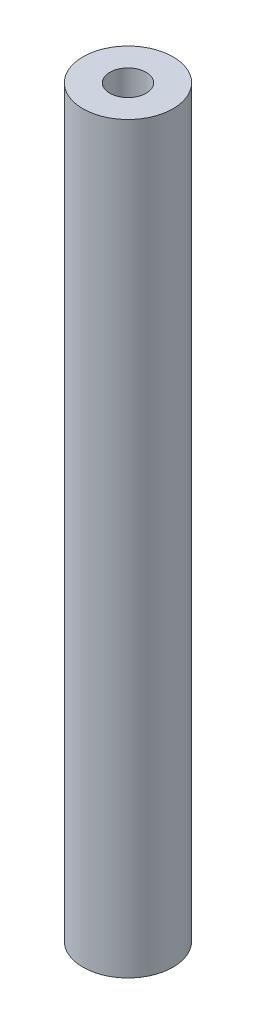
ISO-10303-21;
HEADER;
FILE_DESCRIPTION(('STEP AP214'),'2;1');
FILE_NAME('part.step','',(''),(''),'','','');
FILE_SCHEMA(('AUTOMOTIVE_DESIGN { 1 0 10303 214 1 1 1 1 }'));
ENDSEC;
DATA;
#1=APPLICATION_CONTEXT('core data for automotive mechanical design processes');
#2=APPLICATION_PROTOCOL_DEFINITION('international standard','automotive_design',2000,#1);
#3=PRODUCT_CONTEXT('',#1,'mechanical');
#4=PRODUCT('Part','Part','',(#3));
#5=PRODUCT_RELATED_PRODUCT_CATEGORY('part','',(#4));
#6=PRODUCT_DEFINITION_FORMATION('','',#4);
#7=PRODUCT_DEFINITION_CONTEXT('part definition',#1,'design');
#8=PRODUCT_DEFINITION('design','',#6,#7);
#9=PRODUCT_DEFINITION_SHAPE('','',#8);
#10=(LENGTH_UNIT() NAMED_UNIT(*) SI_UNIT(.MILLI.,.METRE.));
#11=(NAMED_UNIT(*) PLANE_ANGLE_UNIT() SI_UNIT($,.RADIAN.));
#12=(NAMED_UNIT(*) SI_UNIT($,.STERADIAN.) SOLID_ANGLE_UNIT());
#13=UNCERTAINTY_MEASURE_WITH_UNIT(LENGTH_MEASURE(1.E-05),#10,'distance_accuracy_value','');
#14=(GEOMETRIC_REPRESENTATION_CONTEXT(3) GLOBAL_UNCERTAINTY_ASSIGNED_CONTEXT((#13)) GLOBAL_UNIT_ASSIGNED_CONTEXT((#10,
#11,#12)) REPRESENTATION_CONTEXT('',''));
#15=CARTESIAN_POINT('',(0.,0.,0.));
#16=DIRECTION('',(0.,0.,1.));
#17=DIRECTION('',(1.,0.,0.));
#18=AXIS2_PLACEMENT_3D('',#15,#16,#17);
#19=CARTESIAN_POINT('',(0.,-82.55,0.));
#20=DIRECTION('',(0.,1.,0.));
#21=DIRECTION('',(0.,0.,1.));
#22=AXIS2_PLACEMENT_3D('',#19,#20,#21);
#23=CYLINDRICAL_SURFACE('',#22,5.);
#24=CARTESIAN_POINT('',(-1.50000000000002,-68.5,-4.76969600708472));
#25=CARTESIAN_POINT('',(-1.49999897633766,-68.4178054520576,-4.76969685726979));
#26=CARTESIAN_POINT('',(-1.49322108167144,-68.335600775856,-4.77184390209068));
#27=CARTESIAN_POINT('',(-1.46635844446751,-68.173594750408,-4.78016578302899));
#28=CARTESIAN_POINT('',(-1.4462692557358,-68.0937942134985,-4.78634196493467));
#29=CARTESIAN_POINT('',(-1.39352753269957,-67.9389652717282,-4.80196102485632));
#30=CARTESIAN_POINT('',(-1.36089589394245,-67.8639291703669,-4.81139846703232));
#31=CARTESIAN_POINT('',(-1.28406421917931,-67.7203780660047,-4.83246932547567));
#32=CARTESIAN_POINT('',(-1.23986245137054,-67.6518640413155,-4.84410307041019));
#33=CARTESIAN_POINT('',(-1.13964754141628,-67.5211336094226,-4.86866862185765));
#34=CARTESIAN_POINT('',(-1.08333207175808,-67.4591541020537,-4.88162808311635));
#35=CARTESIAN_POINT('',(-0.961136237579611,-67.3453620486775,-4.90714861936757));
#36=CARTESIAN_POINT('',(-0.895254645461126,-67.2935508095501,-4.91970964297705));
#37=CARTESIAN_POINT('',(-0.754111437793702,-67.2005373001667,-4.94333214579389));
#38=CARTESIAN_POINT('',(-0.678684021335823,-67.1595765755572,-4.95435724342404));
#39=CARTESIAN_POINT('',(-0.521624645369358,-67.0910127409572,-4.97334435920684));
#40=CARTESIAN_POINT('',(-0.439994028387916,-67.0634067501425,-4.98130703789495));
#41=CARTESIAN_POINT('',(-0.275323852630832,-67.0231199989095,-4.99307646003589));
#42=CARTESIAN_POINT('',(-0.192391398953802,-67.0100348723473,-4.99699557369338));
#43=CARTESIAN_POINT('',(-0.0254218237493149,-66.9978826753535,-5.00063201501348));
#44=CARTESIAN_POINT('',(0.0586150620503681,-66.998812660598,-5.00035022521079));
#45=CARTESIAN_POINT('',(0.222571156600161,-67.014392868543,-4.99569603817659));
#46=CARTESIAN_POINT('',(0.302536267641344,-67.0286051938098,-4.9914542020526));
#47=CARTESIAN_POINT('',(0.458889213442531,-67.0696313359942,-4.97951522112593));
#48=CARTESIAN_POINT('',(0.53527682132285,-67.0964459509426,-4.97181785750586));
#49=CARTESIAN_POINT('',(0.683347326351286,-67.1622120234185,-4.95365220986963));
#50=CARTESIAN_POINT('',(0.754965064694485,-67.2013012028072,-4.94315269676706));
#51=CARTESIAN_POINT('',(0.890764673783164,-67.2903978524282,-4.92049640648069));
#52=CARTESIAN_POINT('',(0.954944774872138,-67.3404079129635,-4.90833923637778));
#53=CARTESIAN_POINT('',(1.07666048152981,-67.4521977507516,-4.88311550488165));
#54=CARTESIAN_POINT('',(1.13384458040112,-67.5143569190297,-4.87003195321461));
#55=CARTESIAN_POINT('',(1.23707651539824,-67.64751001789,-4.84483979887497));
#56=CARTESIAN_POINT('',(1.28312324482853,-67.7185048253892,-4.83273129317019));
#57=CARTESIAN_POINT('',(1.36313995335452,-67.868239469249,-4.81077903197677));
#58=CARTESIAN_POINT('',(1.39698989237681,-67.9470470458629,-4.80095810695956));
#59=CARTESIAN_POINT('',(1.45083362878414,-68.1096072084455,-4.78496392548436));
#60=CARTESIAN_POINT('',(1.47083194640561,-68.1933581715345,-4.77878947915829));
#61=CARTESIAN_POINT('',(1.49574770282166,-68.3600823607393,-4.77104849541241));
#62=CARTESIAN_POINT('',(1.50119946380212,-68.442968223894,-4.7693187867044));
#63=CARTESIAN_POINT('',(1.49835947233063,-68.6084729000098,-4.77021192441924));
#64=CARTESIAN_POINT('',(1.4900696437133,-68.6910917487308,-4.77283416156589));
#65=CARTESIAN_POINT('',(1.4604576357419,-68.8514883779709,-4.78197558554912));
#66=CARTESIAN_POINT('',(1.4394796143128,-68.9293361642635,-4.78839176507489));
#67=CARTESIAN_POINT('',(1.3854857774794,-69.0804016908149,-4.80429141231227));
#68=CARTESIAN_POINT('',(1.3524681034276,-69.1536187141406,-4.81377535359073));
#69=CARTESIAN_POINT('',(1.274318711965,-69.2955174640721,-4.83505835023047));
#70=CARTESIAN_POINT('',(1.22888564172729,-69.3640247209858,-4.84691271069799));
#71=CARTESIAN_POINT('',(1.12755301600384,-69.4926381061808,-4.87148205646987));
#72=CARTESIAN_POINT('',(1.07165095534896,-69.5527422176128,-4.88419724730003));
#73=CARTESIAN_POINT('',(0.948455132493588,-69.6651804058147,-4.90963633548158));
#74=CARTESIAN_POINT('',(0.880811065857424,-69.717135628987,-4.92234245063004));
#75=CARTESIAN_POINT('',(0.737461784590238,-69.8089667010278,-4.94584851748651));
#76=CARTESIAN_POINT('',(0.661756970543932,-69.8488431497815,-4.95664856384717));
#77=CARTESIAN_POINT('',(0.504935504705207,-69.9150000305683,-4.97505970474957));
#78=CARTESIAN_POINT('',(0.423864622037823,-69.941382016159,-4.98269453424966));
#79=CARTESIAN_POINT('',(0.258169966504572,-69.9800609188904,-4.99401979596827));
#80=CARTESIAN_POINT('',(0.173547217354746,-69.9923618659484,-4.9977113567088));
#81=CARTESIAN_POINT('',(0.00665215388272635,-70.0022230440545,-5.00066544081399));
#82=CARTESIAN_POINT('',(-0.0755851790862232,-70.0003326954078,-5.00009305111322));
#83=CARTESIAN_POINT('',(-0.23851948116442,-69.9831783675009,-4.99497264465037));
#84=CARTESIAN_POINT('',(-0.319216537346544,-69.9679151465195,-4.99042485330462));
#85=CARTESIAN_POINT('',(-0.475935813041377,-69.9247883386004,-4.97791168358326));
#86=CARTESIAN_POINT('',(-0.551998927351414,-69.897061819351,-4.96998352900865));
#87=CARTESIAN_POINT('',(-0.698433237752075,-69.8299180854928,-4.9515294303945));
#88=CARTESIAN_POINT('',(-0.768803496050599,-69.7904989497138,-4.94100305949946));
#89=CARTESIAN_POINT('',(-0.904301892420584,-69.6996265425699,-4.91803965828228));
#90=CARTESIAN_POINT('',(-0.969190250076792,-69.6478285699992,-4.90555226923559));
#91=CARTESIAN_POINT('',(-1.08953757134597,-69.5342896116672,-4.88023537212333));
#92=CARTESIAN_POINT('',(-1.14499380960196,-69.4725457621018,-4.86740576641079));
#93=CARTESIAN_POINT('',(-1.2465626939455,-69.3386592216895,-4.84240680631319));
#94=CARTESIAN_POINT('',(-1.29234759757958,-69.2662614466095,-4.83026852693485));
#95=CARTESIAN_POINT('',(-1.37104313528777,-69.114444825839,-4.80852547508792));
#96=CARTESIAN_POINT('',(-1.40395995557291,-69.0350293763988,-4.79891948596955));
#97=CARTESIAN_POINT('',(-1.45301942532952,-68.8802595683937,-4.78427816717594));
#98=CARTESIAN_POINT('',(-1.47058859011234,-68.805391353069,-4.77886154840519));
#99=CARTESIAN_POINT('',(-1.49407818835146,-68.6536847775042,-4.77157042597166));
#100=CARTESIAN_POINT('',(-1.50000095706097,-68.5768468153547,-4.7696952122143));
#101=CARTESIAN_POINT('',(-1.50000000000002,-68.5,-4.76969600708472));
#102=B_SPLINE_CURVE_WITH_KNOTS('',3,(#24,#25,#26,#27,#28,#29,#30,#31,#32,#33,#34,#35,#36,#37,
#38,#39,#40,#41,#42,#43,#44,#45,#46,#47,#48,#49,#50,#51,#52,#53,#54,#55,#56,#57,#58,#59,#60,#61,
#62,#63,#64,#65,#66,#67,#68,#69,#70,#71,#72,#73,#74,#75,#76,#77,#78,#79,#80,#81,#82,#83,#84,#85,
#86,#87,#88,#89,#90,#91,#92,#93,#94,#95,#96,#97,#98,#99,#100,#101),.UNSPECIFIED.,.T.,.F.,(4,2,2,
2,2,2,2,2,2,2,2,2,2,2,2,2,2,2,2,2,2,2,2,2,2,2,2,2,2,2,2,2,2,2,2,2,2,2,4),(0.,0.246300165915535,
0.492682641689008,0.738656414466206,0.984667025370114,1.23773150007985,1.49082847871274,
1.74915939273647,2.00743455587879,2.2583214014956,2.50915554101443,2.75200125990883,
2.99486235890379,3.2405520933568,3.48630016590834,3.74152147023282,3.99676812491867,
4.25446238246274,4.51207250628416,4.76008080790314,5.00805439107393,5.24958594938823,
5.49115481045793,5.73920731809394,5.98731925928929,6.24479506100608,6.50225807324208,
6.75775391814331,7.01317662321689,7.25876303911227,7.50433553047761,7.74727096872226,
7.99024634491386,8.24099627054496,8.49181852629898,8.75011639669154,9.00828993963952,
9.23861153857455,9.46888695033568),.UNSPECIFIED.);
#103=CARTESIAN_POINT('',(1.50000000000001,-68.5,-4.76969600708473));
#104=VERTEX_POINT('',#103);
#105=CARTESIAN_POINT('',(-1.50000000000002,-68.5,-4.76969600708472));
#106=VERTEX_POINT('',#105);
#107=EDGE_CURVE('E217',#104,#106,#102,.T.);
#108=ORIENTED_EDGE('',*,*,#107,.F.);
#109=DIRECTION('',(0.,1.,0.));
#110=VECTOR('',#109,1.);
#111=CARTESIAN_POINT('',(1.5,-82.55,-4.76969600708473));
#112=LINE('',#111,#110);
#113=CARTESIAN_POINT('',(1.50000000000001,-63.5,-4.76969600708473));
#114=VERTEX_POINT('',#113);
#115=EDGE_CURVE('E11',#114,#104,#112,.F.);
#116=ORIENTED_EDGE('',*,*,#115,.F.);
#117=CARTESIAN_POINT('',(-1.50000000000002,-63.5,-4.76969600708472));
#118=CARTESIAN_POINT('',(-1.49999897633766,-63.4178054520576,-4.76969685726979));
#119=CARTESIAN_POINT('',(-1.49322108167144,-63.335600775856,-4.77184390209068));
#120=CARTESIAN_POINT('',(-1.46635844446751,-63.1735947504081,-4.78016578302899));
#121=CARTESIAN_POINT('',(-1.4462692557358,-63.0937942134985,-4.78634196493467));
#122=CARTESIAN_POINT('',(-1.39352753269957,-62.9389652717283,-4.80196102485632));
#123=CARTESIAN_POINT('',(-1.36089589394245,-62.8639291703669,-4.81139846703232));
#124=CARTESIAN_POINT('',(-1.28406421917931,-62.7203780660047,-4.83246932547567));
#125=CARTESIAN_POINT('',(-1.23986245137054,-62.6518640413155,-4.84410307041019));
#126=CARTESIAN_POINT('',(-1.13964754141628,-62.5211336094226,-4.86866862185765));
#127=CARTESIAN_POINT('',(-1.08333207175808,-62.4591541020537,-4.88162808311635));
#128=CARTESIAN_POINT('',(-0.961136237579609,-62.3453620486775,-4.90714861936757));
#129=CARTESIAN_POINT('',(-0.895254645461121,-62.2935508095501,-4.91970964297705));
#130=CARTESIAN_POINT('',(-0.754111437793697,-62.2005373001667,-4.94333214579389));
#131=CARTESIAN_POINT('',(-0.67868402133582,-62.1595765755572,-4.95435724342404));
#132=CARTESIAN_POINT('',(-0.521624645369357,-62.0910127409572,-4.97334435920684));
#133=CARTESIAN_POINT('',(-0.439994028387913,-62.0634067501425,-4.98130703789495));
#134=CARTESIAN_POINT('',(-0.27532385263083,-62.0231199989095,-4.99307646003589));
#135=CARTESIAN_POINT('',(-0.192391398953801,-62.0100348723473,-4.99699557369338));
#136=CARTESIAN_POINT('',(-0.0254218237493146,-61.9978826753536,-5.00063201501348));
#137=CARTESIAN_POINT('',(0.0586150620503687,-61.998812660598,-5.00035022521079));
#138=CARTESIAN_POINT('',(0.222571156600162,-62.014392868543,-4.99569603817658));
#139=CARTESIAN_POINT('',(0.302536267641344,-62.0286051938099,-4.9914542020526));
#140=CARTESIAN_POINT('',(0.45888921344253,-62.0696313359943,-4.97951522112593));
#141=CARTESIAN_POINT('',(0.535276821322849,-62.0964459509427,-4.97181785750586));
#142=CARTESIAN_POINT('',(0.683347326351285,-62.1622120234186,-4.95365220986963));
#143=CARTESIAN_POINT('',(0.754965064694483,-62.2013012028073,-4.94315269676706));
#144=CARTESIAN_POINT('',(0.890764673783162,-62.2903978524282,-4.92049640648069));
#145=CARTESIAN_POINT('',(0.954944774872136,-62.3404079129635,-4.90833923637778));
#146=CARTESIAN_POINT('',(1.0766604815298,-62.4521977507516,-4.88311550488165));
#147=CARTESIAN_POINT('',(1.13384458040112,-62.5143569190297,-4.87003195321461));
#148=CARTESIAN_POINT('',(1.23707651539824,-62.6475100178901,-4.84483979887497));
#149=CARTESIAN_POINT('',(1.28312324482853,-62.7185048253892,-4.83273129317019));
#150=CARTESIAN_POINT('',(1.36313995335451,-62.868239469249,-4.81077903197677));
#151=CARTESIAN_POINT('',(1.3969898923768,-62.9470470458629,-4.80095810695956));
#152=CARTESIAN_POINT('',(1.45083362878414,-63.1096072084456,-4.78496392548436));
#153=CARTESIAN_POINT('',(1.47083194640561,-63.1933581715346,-4.77878947915829));
#154=CARTESIAN_POINT('',(1.49574770282166,-63.3600823607393,-4.77104849541241));
#155=CARTESIAN_POINT('',(1.50119946380213,-63.442968223894,-4.7693187867044));
#156=CARTESIAN_POINT('',(1.49835947233063,-63.6084729000099,-4.77021192441924));
#157=CARTESIAN_POINT('',(1.4900696437133,-63.6910917487309,-4.77283416156589));
#158=CARTESIAN_POINT('',(1.4604576357419,-63.8514883779709,-4.78197558554912));
#159=CARTESIAN_POINT('',(1.4394796143128,-63.9293361642636,-4.78839176507489));
#160=CARTESIAN_POINT('',(1.3854857774794,-64.0804016908149,-4.80429141231227));
#161=CARTESIAN_POINT('',(1.3524681034276,-64.1536187141406,-4.81377535359073));
#162=CARTESIAN_POINT('',(1.274318711965,-64.2955174640721,-4.83505835023047));
#163=CARTESIAN_POINT('',(1.22888564172728,-64.3640247209858,-4.84691271069799));
#164=CARTESIAN_POINT('',(1.12755301600384,-64.4926381061808,-4.87148205646987));
#165=CARTESIAN_POINT('',(1.07165095534896,-64.5527422176128,-4.88419724730003));
#166=CARTESIAN_POINT('',(0.94845513249359,-64.6651804058148,-4.90963633548158));
#167=CARTESIAN_POINT('',(0.880811065857425,-64.717135628987,-4.92234245063004));
#168=CARTESIAN_POINT('',(0.737461784590238,-64.8089667010278,-4.94584851748651));
#169=CARTESIAN_POINT('',(0.661756970543932,-64.8488431497815,-4.95664856384717));
#170=CARTESIAN_POINT('',(0.504935504705207,-64.9150000305683,-4.97505970474957));
#171=CARTESIAN_POINT('',(0.423864622037824,-64.941382016159,-4.98269453424966));
#172=CARTESIAN_POINT('',(0.258169966504572,-64.9800609188904,-4.99401979596827));
#173=CARTESIAN_POINT('',(0.173547217354746,-64.9923618659484,-4.9977113567088));
#174=CARTESIAN_POINT('',(0.00665215388272632,-65.0022230440545,-5.00066544081399));
#175=CARTESIAN_POINT('',(-0.0755851790862232,-65.0003326954078,-5.00009305111322));
#176=CARTESIAN_POINT('',(-0.23851948116442,-64.9831783675009,-4.99497264465037));
#177=CARTESIAN_POINT('',(-0.319216537346545,-64.9679151465196,-4.99042485330462));
#178=CARTESIAN_POINT('',(-0.475935813041377,-64.9247883386004,-4.97791168358326));
#179=CARTESIAN_POINT('',(-0.551998927351414,-64.897061819351,-4.96998352900865));
#180=CARTESIAN_POINT('',(-0.698433237752075,-64.8299180854928,-4.9515294303945));
#181=CARTESIAN_POINT('',(-0.768803496050599,-64.7904989497138,-4.94100305949946));
#182=CARTESIAN_POINT('',(-0.904301892420584,-64.69962654257,-4.91803965828228));
#183=CARTESIAN_POINT('',(-0.969190250076792,-64.6478285699992,-4.90555226923559));
#184=CARTESIAN_POINT('',(-1.08953757134597,-64.5342896116672,-4.88023537212333));
#185=CARTESIAN_POINT('',(-1.14499380960196,-64.4725457621018,-4.86740576641079));
#186=CARTESIAN_POINT('',(-1.2465626939455,-64.3386592216895,-4.84240680631319));
#187=CARTESIAN_POINT('',(-1.29234759757958,-64.2662614466096,-4.83026852693485));
#188=CARTESIAN_POINT('',(-1.37104313528777,-64.114444825839,-4.80852547508792));
#189=CARTESIAN_POINT('',(-1.40395995557291,-64.0350293763988,-4.79891948596955));
#190=CARTESIAN_POINT('',(-1.45301942532952,-63.8802595683937,-4.78427816717594));
#191=CARTESIAN_POINT('',(-1.47058859011234,-63.805391353069,-4.77886154840519));
#192=CARTESIAN_POINT('',(-1.49407818835146,-63.6536847775042,-4.77157042597166));
#193=CARTESIAN_POINT('',(-1.50000095706097,-63.5768468153547,-4.7696952122143));
#194=CARTESIAN_POINT('',(-1.50000000000002,-63.5,-4.76969600708472));
#195=B_SPLINE_CURVE_WITH_KNOTS('',3,(#117,#118,#119,#120,#121,#122,#123,#124,#125,#126,#127,
#128,#129,#130,#131,#132,#133,#134,#135,#136,#137,#138,#139,#140,#141,#142,#143,#144,#145,#146,
#147,#148,#149,#150,#151,#152,#153,#154,#155,#156,#157,#158,#159,#160,#161,#162,#163,#164,#165,
#166,#167,#168,#169,#170,#171,#172,#173,#174,#175,#176,#177,#178,#179,#180,#181,#182,#183,#184,
#185,#186,#187,#188,#189,#190,#191,#192,#193,#194),.UNSPECIFIED.,.T.,.F.,(4,2,2,2,2,2,2,2,2,2,2,
2,2,2,2,2,2,2,2,2,2,2,2,2,2,2,2,2,2,2,2,2,2,2,2,2,2,2,4),(0.,0.246300165915535,
0.492682641689008,0.738656414466206,0.984667025370114,1.23773150007985,1.49082847871275,
1.74915939273647,2.0074345558788,2.25832140149561,2.50915554101443,2.75200125990883,
2.99486235890379,3.24055209335679,3.48630016590834,3.74152147023282,3.99676812491867,
4.25446238246271,4.51207250628416,4.76008080790315,5.00805439107393,5.24958594938823,
5.49115481045793,5.73920731809395,5.98731925928929,6.24479506100608,6.50225807324209,
6.75775391814331,7.01317662321689,7.25876303911227,7.50433553047761,7.74727096872226,
7.99024634491386,8.24099627054496,8.49181852629898,8.75011639669154,9.00828993963953,
9.23861153857455,9.46888695033568),.UNSPECIFIED.);
#196=CARTESIAN_POINT('',(-1.50000000000002,-63.5,-4.76969600708472));
#197=VERTEX_POINT('',#196);
#198=EDGE_CURVE('E49',#197,#114,#195,.T.);
#199=ORIENTED_EDGE('',*,*,#198,.F.);
#200=DIRECTION('',(0.,1.,0.));
#201=VECTOR('',#200,1.);
#202=CARTESIAN_POINT('',(-1.50000000000002,-82.55,-4.76969600708472));
#203=LINE('',#202,#201);
#204=EDGE_CURVE('E263',#197,#106,#203,.F.);
#205=ORIENTED_EDGE('',*,*,#204,.T.);
#206=EDGE_LOOP('',(#108,#116,#199,#205));
#207=FACE_BOUND('',#206,.T.);
#208=CARTESIAN_POINT('',(-1.5,-15.39,-4.76969600708473));
#209=CARTESIAN_POINT('',(-1.49999897633764,-15.3078054520576,-4.7696968572698));
#210=CARTESIAN_POINT('',(-1.49322108167142,-15.225600775856,-4.77184390209069));
#211=CARTESIAN_POINT('',(-1.46635844446749,-15.063594750408,-4.780165783029));
#212=CARTESIAN_POINT('',(-1.44626925573578,-14.9837942134985,-4.78634196493468));
#213=CARTESIAN_POINT('',(-1.39352753269955,-14.8289652717283,-4.80196102485632));
#214=CARTESIAN_POINT('',(-1.36089589394243,-14.7539291703669,-4.81139846703232));
#215=CARTESIAN_POINT('',(-1.28406421917929,-14.6103780660047,-4.83246932547567));
#216=CARTESIAN_POINT('',(-1.23986245137053,-14.5418640413156,-4.84410307041019));
#217=CARTESIAN_POINT('',(-1.13964754141627,-14.4111336094226,-4.86866862185765));
#218=CARTESIAN_POINT('',(-1.08333207175807,-14.3491541020537,-4.88162808311636));
#219=CARTESIAN_POINT('',(-0.9611362375796,-14.2353620486775,-4.90714861936757));
#220=CARTESIAN_POINT('',(-0.895254645461113,-14.1835508095501,-4.91970964297705));
#221=CARTESIAN_POINT('',(-0.754111437793691,-14.0905373001667,-4.94333214579389));
#222=CARTESIAN_POINT('',(-0.678684021335816,-14.0495765755572,-4.95435724342404));
#223=CARTESIAN_POINT('',(-0.521624645369355,-13.9810127409572,-4.97334435920684));
#224=CARTESIAN_POINT('',(-0.439994028387913,-13.9534067501425,-4.98130703789495));
#225=CARTESIAN_POINT('',(-0.27532385263083,-13.9131199989095,-4.99307646003589));
#226=CARTESIAN_POINT('',(-0.192391398953802,-13.9000348723473,-4.99699557369338));
#227=CARTESIAN_POINT('',(-0.0254218237493163,-13.8878826753536,-5.00063201501348));
#228=CARTESIAN_POINT('',(0.0586150620503669,-13.888812660598,-5.00035022521079));
#229=CARTESIAN_POINT('',(0.222571156600159,-13.904392868543,-4.99569603817659));
#230=CARTESIAN_POINT('',(0.30253626764134,-13.9186051938099,-4.9914542020526));
#231=CARTESIAN_POINT('',(0.458889213442525,-13.9596313359943,-4.97951522112593));
#232=CARTESIAN_POINT('',(0.535276821322844,-13.9864459509427,-4.97181785750586));
#233=CARTESIAN_POINT('',(0.683347326351279,-14.0522120234185,-4.95365220986963));
#234=CARTESIAN_POINT('',(0.754965064694476,-14.0913012028073,-4.94315269676706));
#235=CARTESIAN_POINT('',(0.890764673783154,-14.1803978524282,-4.92049640648069));
#236=CARTESIAN_POINT('',(0.954944774872129,-14.2304079129635,-4.90833923637778));
#237=CARTESIAN_POINT('',(1.0766604815298,-14.3421977507516,-4.88311550488165));
#238=CARTESIAN_POINT('',(1.13384458040111,-14.4043569190297,-4.87003195321461));
#239=CARTESIAN_POINT('',(1.23707651539823,-14.53751001789,-4.84483979887497));
#240=CARTESIAN_POINT('',(1.28312324482852,-14.6085048253892,-4.8327312931702));
#241=CARTESIAN_POINT('',(1.3631399533545,-14.758239469249,-4.81077903197678));
#242=CARTESIAN_POINT('',(1.39698989237679,-14.8370470458629,-4.80095810695957));
#243=CARTESIAN_POINT('',(1.45083362878413,-14.9996072084455,-4.78496392548436));
#244=CARTESIAN_POINT('',(1.4708319464056,-15.0833581715345,-4.7787894791583));
#245=CARTESIAN_POINT('',(1.49574770282165,-15.2500823607393,-4.77104849541241));
#246=CARTESIAN_POINT('',(1.50119946380212,-15.332968223894,-4.76931878670441));
#247=CARTESIAN_POINT('',(1.49835947233062,-15.4984729000099,-4.77021192441924));
#248=CARTESIAN_POINT('',(1.4900696437133,-15.5810917487308,-4.77283416156589));
#249=CARTESIAN_POINT('',(1.4604576357419,-15.7414883779709,-4.78197558554912));
#250=CARTESIAN_POINT('',(1.4394796143128,-15.8193361642635,-4.78839176507489));
#251=CARTESIAN_POINT('',(1.3854857774794,-15.9704016908149,-4.80429141231227));
#252=CARTESIAN_POINT('',(1.3524681034276,-16.0436187141406,-4.81377535359073));
#253=CARTESIAN_POINT('',(1.274318711965,-16.1855174640721,-4.83505835023047));
#254=CARTESIAN_POINT('',(1.22888564172729,-16.2540247209858,-4.84691271069799));
#255=CARTESIAN_POINT('',(1.12755301600385,-16.3826381061808,-4.87148205646987));
#256=CARTESIAN_POINT('',(1.07165095534897,-16.4427422176128,-4.88419724730003));
#257=CARTESIAN_POINT('',(0.948455132493601,-16.5551804058147,-4.90963633548158));
#258=CARTESIAN_POINT('',(0.880811065857437,-16.607135628987,-4.92234245063004));
#259=CARTESIAN_POINT('',(0.737461784590251,-16.6989667010277,-4.94584851748651));
#260=CARTESIAN_POINT('',(0.661756970543946,-16.7388431497815,-4.95664856384717));
#261=CARTESIAN_POINT('',(0.504935504705224,-16.8050000305683,-4.97505970474957));
#262=CARTESIAN_POINT('',(0.423864622037842,-16.831382016159,-4.98269453424965));
#263=CARTESIAN_POINT('',(0.258169966504592,-16.8700609188904,-4.99401979596827));
#264=CARTESIAN_POINT('',(0.173547217354766,-16.8823618659484,-4.9977113567088));
#265=CARTESIAN_POINT('',(0.00665215388274591,-16.8922230440545,-5.00066544081399));
#266=CARTESIAN_POINT('',(-0.0755851790862039,-16.8903326954078,-5.00009305111322));
#267=CARTESIAN_POINT('',(-0.238519481164402,-16.8731783675009,-4.99497264465037));
#268=CARTESIAN_POINT('',(-0.319216537346527,-16.8579151465196,-4.99042485330463));
#269=CARTESIAN_POINT('',(-0.475935813041356,-16.8147883386004,-4.97791168358327));
#270=CARTESIAN_POINT('',(-0.55199892735139,-16.787061819351,-4.96998352900866));
#271=CARTESIAN_POINT('',(-0.698433237752051,-16.7199180854928,-4.9515294303945));
#272=CARTESIAN_POINT('',(-0.768803496050578,-16.6804989497138,-4.94100305949946));
#273=CARTESIAN_POINT('',(-0.904301892420561,-16.58962654257,-4.91803965828228));
#274=CARTESIAN_POINT('',(-0.969190250076765,-16.5378285699992,-4.90555226923559));
#275=CARTESIAN_POINT('',(-1.08953757134594,-16.4242896116672,-4.88023537212334));
#276=CARTESIAN_POINT('',(-1.14499380960193,-16.3625457621018,-4.86740576641079));
#277=CARTESIAN_POINT('',(-1.24656269394548,-16.2286592216895,-4.84240680631319));
#278=CARTESIAN_POINT('',(-1.29234759757956,-16.1562614466096,-4.83026852693485));
#279=CARTESIAN_POINT('',(-1.37104313528776,-16.004444825839,-4.80852547508793));
#280=CARTESIAN_POINT('',(-1.40395995557288,-15.9250293763988,-4.79891948596956));
#281=CARTESIAN_POINT('',(-1.45301942532949,-15.7702595683937,-4.78427816717594));
#282=CARTESIAN_POINT('',(-1.47058859011231,-15.695391353069,-4.7788615484052));
#283=CARTESIAN_POINT('',(-1.49407818835144,-15.5436847775042,-4.77157042597167));
#284=CARTESIAN_POINT('',(-1.50000095706095,-15.4668468153547,-4.7696952122143));
#285=CARTESIAN_POINT('',(-1.5,-15.39,-4.76969600708473));
#286=B_SPLINE_CURVE_WITH_KNOTS('',3,(#208,#209,#210,#211,#212,#213,#214,#215,#216,#217,#218,
#219,#220,#221,#222,#223,#224,#225,#226,#227,#228,#229,#230,#231,#232,#233,#234,#235,#236,#237,
#238,#239,#240,#241,#242,#243,#244,#245,#246,#247,#248,#249,#250,#251,#252,#253,#254,#255,#256,
#257,#258,#259,#260,#261,#262,#263,#264,#265,#266,#267,#268,#269,#270,#271,#272,#273,#274,#275,
#276,#277,#278,#279,#280,#281,#282,#283,#284,#285),.UNSPECIFIED.,.T.,.F.,(4,2,2,2,2,2,2,2,2,2,2,
2,2,2,2,2,2,2,2,2,2,2,2,2,2,2,2,2,2,2,2,2,2,2,2,2,2,2,4),(0.,0.246300165915544,
0.492682641688999,0.738656414466193,0.9846670253701,1.23773150007984,1.49082847871273,
1.74915939273644,2.00743455587877,2.25832140149558,2.5091555410144,2.7520012599088,
2.99486235890376,3.24055209335676,3.4863001659083,3.74152147023278,3.99676812491863,
4.25446238246266,4.51207250628411,4.76008080790309,5.00805439107387,5.24958594938817,
5.49115481045787,5.73920731809388,5.98731925928922,6.24479506100602,6.50225807324202,
6.75775391814324,7.01317662321682,7.2587630391122,7.50433553047754,7.74727096872219,
7.99024634491378,8.24099627054488,8.4918185262989,8.75011639669147,9.00828993963944,
9.23861153857447,9.4688869503356),.UNSPECIFIED.);
#287=CARTESIAN_POINT('',(1.5,-15.39,-4.76969600708473));
#288=VERTEX_POINT('',#287);
#289=CARTESIAN_POINT('',(-1.5,-15.39,-4.76969600708473));
#290=VERTEX_POINT('',#289);
#291=EDGE_CURVE('E178',#288,#290,#286,.T.);
#292=ORIENTED_EDGE('',*,*,#291,.F.);
#293=DIRECTION('',(0.,1.,0.));
#294=VECTOR('',#293,1.);
#295=CARTESIAN_POINT('',(1.49999999999999,-82.55,-4.76969600708473));
#296=LINE('',#295,#294);
#297=CARTESIAN_POINT('',(1.5,-10.39,-4.76969600708473));
#298=VERTEX_POINT('',#297);
#299=EDGE_CURVE('E226',#298,#288,#296,.F.);
#300=ORIENTED_EDGE('',*,*,#299,.F.);
#301=CARTESIAN_POINT('',(-1.49999999999999,-10.39,-4.76969600708473));
#302=CARTESIAN_POINT('',(-1.49999897633763,-10.3078054520576,-4.7696968572698));
#303=CARTESIAN_POINT('',(-1.49322108167141,-10.225600775856,-4.77184390209069));
#304=CARTESIAN_POINT('',(-1.46635844446748,-10.0635947504081,-4.780165783029));
#305=CARTESIAN_POINT('',(-1.44626925573577,-9.98379421349855,-4.78634196493468));
#306=CARTESIAN_POINT('',(-1.39352753269954,-9.82896527172828,-4.80196102485633));
#307=CARTESIAN_POINT('',(-1.36089589394242,-9.75392917036693,-4.81139846703232));
#308=CARTESIAN_POINT('',(-1.28406421917928,-9.61037806600471,-4.83246932547567));
#309=CARTESIAN_POINT('',(-1.23986245137051,-9.54186404131558,-4.8441030704102));
#310=CARTESIAN_POINT('',(-1.13964754141626,-9.41113360942264,-4.86866862185766));
#311=CARTESIAN_POINT('',(-1.08333207175806,-9.34915410205372,-4.88162808311636));
#312=CARTESIAN_POINT('',(-0.961136237579587,-9.2353620486775,-4.90714861936757));
#313=CARTESIAN_POINT('',(-0.8952546454611,-9.18355080955013,-4.91970964297705));
#314=CARTESIAN_POINT('',(-0.754111437793678,-9.09053730016671,-4.94333214579389));
#315=CARTESIAN_POINT('',(-0.678684021335803,-9.0495765755572,-4.95435724342404));
#316=CARTESIAN_POINT('',(-0.521624645369342,-8.98101274095726,-4.97334435920684));
#317=CARTESIAN_POINT('',(-0.4399940283879,-8.95340675014256,-4.98130703789495));
#318=CARTESIAN_POINT('',(-0.275323852630817,-8.9131199989095,-4.99307646003589));
#319=CARTESIAN_POINT('',(-0.192391398953789,-8.90003487234731,-4.99699557369338));
#320=CARTESIAN_POINT('',(-0.0254218237493032,-8.88788267535357,-5.00063201501348));
#321=CARTESIAN_POINT('',(0.0586150620503801,-8.88881266059805,-5.00035022521079));
#322=CARTESIAN_POINT('',(0.222571156600172,-8.90439286854304,-4.99569603817658));
#323=CARTESIAN_POINT('',(0.302536267641353,-8.91860519380988,-4.9914542020526));
#324=CARTESIAN_POINT('',(0.458889213442538,-8.9596313359943,-4.97951522112593));
#325=CARTESIAN_POINT('',(0.535276821322857,-8.98644595094268,-4.97181785750586));
#326=CARTESIAN_POINT('',(0.683347326351292,-9.05221202341857,-4.95365220986963));
#327=CARTESIAN_POINT('',(0.754965064694489,-9.09130120280728,-4.94315269676706));
#328=CARTESIAN_POINT('',(0.890764673783167,-9.18039785242824,-4.92049640648069));
#329=CARTESIAN_POINT('',(0.954944774872142,-9.2304079129635,-4.90833923637778));
#330=CARTESIAN_POINT('',(1.07666048152981,-9.34219775075161,-4.88311550488165));
#331=CARTESIAN_POINT('',(1.13384458040113,-9.40435691902975,-4.87003195321461));
#332=CARTESIAN_POINT('',(1.23707651539825,-9.53751001789006,-4.84483979887497));
#333=CARTESIAN_POINT('',(1.28312324482854,-9.60850482538924,-4.83273129317019));
#334=CARTESIAN_POINT('',(1.36313995335451,-9.758239469249,-4.81077903197677));
#335=CARTESIAN_POINT('',(1.39698989237681,-9.83704704586293,-4.80095810695956));
#336=CARTESIAN_POINT('',(1.45083362878415,-9.99960720844556,-4.78496392548436));
#337=CARTESIAN_POINT('',(1.47083194640561,-10.0833581715346,-4.77878947915829));
#338=CARTESIAN_POINT('',(1.49574770282166,-10.2500823607393,-4.77104849541241));
#339=CARTESIAN_POINT('',(1.50119946380213,-10.332968223894,-4.7693187867044));
#340=CARTESIAN_POINT('',(1.49835947233063,-10.4984729000099,-4.77021192441923));
#341=CARTESIAN_POINT('',(1.49006964371331,-10.5810917487309,-4.77283416156589));
#342=CARTESIAN_POINT('',(1.46045763574191,-10.7414883779709,-4.78197558554912));
#343=CARTESIAN_POINT('',(1.43947961431281,-10.8193361642635,-4.78839176507488));
#344=CARTESIAN_POINT('',(1.38548577747941,-10.9704016908149,-4.80429141231227));
#345=CARTESIAN_POINT('',(1.35246810342761,-11.0436187141406,-4.81377535359073));
#346=CARTESIAN_POINT('',(1.27431871196502,-11.1855174640721,-4.83505835023047));
#347=CARTESIAN_POINT('',(1.2288856417273,-11.2540247209858,-4.84691271069798));
#348=CARTESIAN_POINT('',(1.12755301600386,-11.3826381061808,-4.87148205646987));
#349=CARTESIAN_POINT('',(1.07165095534898,-11.4427422176128,-4.88419724730003));
#350=CARTESIAN_POINT('',(0.948455132493612,-11.5551804058147,-4.90963633548158));
#351=CARTESIAN_POINT('',(0.880811065857447,-11.607135628987,-4.92234245063004));
#352=CARTESIAN_POINT('',(0.737461784590263,-11.6989667010278,-4.9458485174865));
#353=CARTESIAN_POINT('',(0.661756970543958,-11.7388431497815,-4.95664856384717));
#354=CARTESIAN_POINT('',(0.504935504705236,-11.8050000305683,-4.97505970474957));
#355=CARTESIAN_POINT('',(0.423864622037853,-11.831382016159,-4.98269453424965));
#356=CARTESIAN_POINT('',(0.258169966504602,-11.8700609188904,-4.99401979596827));
#357=CARTESIAN_POINT('',(0.173547217354777,-11.8823618659484,-4.9977113567088));
#358=CARTESIAN_POINT('',(0.00665215388275694,-11.8922230440545,-5.00066544081399));
#359=CARTESIAN_POINT('',(-0.0755851790861925,-11.8903326954078,-5.00009305111322));
#360=CARTESIAN_POINT('',(-0.23851948116439,-11.8731783675009,-4.99497264465037));
#361=CARTESIAN_POINT('',(-0.319216537346515,-11.8579151465196,-4.99042485330463));
#362=CARTESIAN_POINT('',(-0.475935813041345,-11.8147883386004,-4.97791168358327));
#363=CARTESIAN_POINT('',(-0.551998927351378,-11.787061819351,-4.96998352900866));
#364=CARTESIAN_POINT('',(-0.698433237752039,-11.7199180854928,-4.9515294303945));
#365=CARTESIAN_POINT('',(-0.768803496050566,-11.6804989497138,-4.94100305949946));
#366=CARTESIAN_POINT('',(-0.904301892420549,-11.58962654257,-4.91803965828228));
#367=CARTESIAN_POINT('',(-0.969190250076752,-11.5378285699992,-4.90555226923559));
#368=CARTESIAN_POINT('',(-1.08953757134593,-11.4242896116672,-4.88023537212334));
#369=CARTESIAN_POINT('',(-1.14499380960192,-11.3625457621019,-4.86740576641079));
#370=CARTESIAN_POINT('',(-1.24656269394547,-11.2286592216895,-4.84240680631319));
#371=CARTESIAN_POINT('',(-1.29234759757955,-11.1562614466096,-4.83026852693486));
#372=CARTESIAN_POINT('',(-1.37104313528774,-11.004444825839,-4.80852547508793));
#373=CARTESIAN_POINT('',(-1.40395995557287,-10.9250293763988,-4.79891948596956));
#374=CARTESIAN_POINT('',(-1.45301942532948,-10.7702595683937,-4.78427816717595));
#375=CARTESIAN_POINT('',(-1.4705885901123,-10.695391353069,-4.7788615484052));
#376=CARTESIAN_POINT('',(-1.49407818835143,-10.5436847775042,-4.77157042597167));
#377=CARTESIAN_POINT('',(-1.50000095706094,-10.4668468153548,-4.76969521221431));
#378=CARTESIAN_POINT('',(-1.49999999999999,-10.39,-4.76969600708473));
#379=B_SPLINE_CURVE_WITH_KNOTS('',3,(#301,#302,#303,#304,#305,#306,#307,#308,#309,#310,#311,
#312,#313,#314,#315,#316,#317,#318,#319,#320,#321,#322,#323,#324,#325,#326,#327,#328,#329,#330,
#331,#332,#333,#334,#335,#336,#337,#338,#339,#340,#341,#342,#343,#344,#345,#346,#347,#348,#349,
#350,#351,#352,#353,#354,#355,#356,#357,#358,#359,#360,#361,#362,#363,#364,#365,#366,#367,#368,
#369,#370,#371,#372,#373,#374,#375,#376,#377,#378),.UNSPECIFIED.,.T.,.F.,(4,2,2,2,2,2,2,2,2,2,2,
2,2,2,2,2,2,2,2,2,2,2,2,2,2,2,2,2,2,2,2,2,2,2,2,2,2,2,4),(0.,0.246300165915542,
0.492682641688999,0.738656414466193,0.9846670253701,1.23773150007984,1.49082847871273,
1.74915939273644,2.00743455587877,2.25832140149558,2.5091555410144,2.7520012599088,
2.99486235890376,3.24055209335676,3.4863001659083,3.74152147023278,3.99676812491863,
4.25446238246266,4.51207250628411,4.76008080790309,5.00805439107388,5.24958594938817,
5.49115481045787,5.73920731809388,5.98731925928923,6.24479506100602,6.50225807324202,
6.75775391814325,7.01317662321682,7.2587630391122,7.50433553047754,7.74727096872219,
7.99024634491378,8.24099627054488,8.4918185262989,8.75011639669147,9.00828993963944,
9.23861153857447,9.4688869503356),.UNSPECIFIED.);
#380=CARTESIAN_POINT('',(-1.5,-10.39,-4.76969600708473));
#381=VERTEX_POINT('',#380);
#382=EDGE_CURVE('E231',#381,#298,#379,.T.);
#383=ORIENTED_EDGE('',*,*,#382,.F.);
#384=DIRECTION('',(0.,1.,0.));
#385=VECTOR('',#384,1.);
#386=CARTESIAN_POINT('',(-1.50000000000001,-82.55,-4.76969600708473));
#387=LINE('',#386,#385);
#388=EDGE_CURVE('E186',#381,#290,#387,.F.);
#389=ORIENTED_EDGE('',*,*,#388,.T.);
#390=EDGE_LOOP('',(#292,#300,#383,#389));
#391=FACE_BOUND('',#390,.T.);
#392=CARTESIAN_POINT('',(0.,-82.55,0.));
#393=DIRECTION('',(0.,1.,0.));
#394=DIRECTION('',(0.,0.,1.));
#395=AXIS2_PLACEMENT_3D('',#392,#393,#394);
#396=CIRCLE('',#395,5.);
#397=CARTESIAN_POINT('',(0.,-82.55,5.));
#398=VERTEX_POINT('',#397);
#399=EDGE_CURVE('E175',#398,#398,#396,.T.);
#400=ORIENTED_EDGE('',*,*,#399,.T.);
#401=EDGE_LOOP('',(#400));
#402=FACE_BOUND('',#401,.T.);
#403=CARTESIAN_POINT('',(0.,0.,0.));
#404=DIRECTION('',(0.,1.,0.));
#405=DIRECTION('',(0.,0.,1.));
#406=AXIS2_PLACEMENT_3D('',#403,#404,#405);
#407=CIRCLE('',#406,5.);
#408=CARTESIAN_POINT('',(0.,0.,5.));
#409=VERTEX_POINT('',#408);
#410=EDGE_CURVE('E146',#409,#409,#407,.T.);
#411=ORIENTED_EDGE('',*,*,#410,.F.);
#412=EDGE_LOOP('',(#411));
#413=FACE_BOUND('',#412,.T.);
#414=ADVANCED_FACE('F41',(#207,#391,#402,#413),#23,.T.);
#415=CARTESIAN_POINT('',(0.,-82.55,0.));
#416=DIRECTION('',(0.,1.,0.));
#417=DIRECTION('',(0.,0.,1.));
#418=AXIS2_PLACEMENT_3D('',#415,#416,#417);
#419=PLANE('',#418);
#420=CARTESIAN_POINT('',(0.,-82.55,0.));
#421=DIRECTION('',(0.,-1.,0.));
#422=DIRECTION('',(0.,0.,-1.));
#423=AXIS2_PLACEMENT_3D('',#420,#421,#422);
#424=CIRCLE('',#423,2.0193);
#425=CARTESIAN_POINT('',(0.,-82.55,-2.0193));
#426=VERTEX_POINT('',#425);
#427=EDGE_CURVE('E120',#426,#426,#424,.T.);
#428=ORIENTED_EDGE('',*,*,#427,.F.);
#429=EDGE_LOOP('',(#428));
#430=FACE_BOUND('',#429,.T.);
#431=ORIENTED_EDGE('',*,*,#399,.F.);
#432=EDGE_LOOP('',(#431));
#433=FACE_BOUND('',#432,.T.);
#434=ADVANCED_FACE('F203',(#430,#433),#419,.F.);
#435=CARTESIAN_POINT('',(0.,0.,0.));
#436=DIRECTION('',(0.,1.,0.));
#437=DIRECTION('',(0.,0.,1.));
#438=AXIS2_PLACEMENT_3D('',#435,#436,#437);
#439=PLANE('',#438);
#440=CARTESIAN_POINT('',(0.,0.,0.));
#441=DIRECTION('',(0.,1.,0.));
#442=DIRECTION('',(0.,0.,1.));
#443=AXIS2_PLACEMENT_3D('',#440,#441,#442);
#444=CIRCLE('',#443,2.0193);
#445=CARTESIAN_POINT('',(0.,0.,2.0193));
#446=VERTEX_POINT('',#445);
#447=EDGE_CURVE('E119',#446,#446,#444,.T.);
#448=ORIENTED_EDGE('',*,*,#447,.F.);
#449=EDGE_LOOP('',(#448));
#450=FACE_BOUND('',#449,.T.);
#451=ORIENTED_EDGE('',*,*,#410,.T.);
#452=EDGE_LOOP('',(#451));
#453=FACE_BOUND('',#452,.T.);
#454=ADVANCED_FACE('F201',(#450,#453),#439,.T.);
#455=CARTESIAN_POINT('',(1.5,0.,-2.46));
#456=DIRECTION('',(1.,0.,0.));
#457=DIRECTION('',(0.,1.,0.));
#458=AXIS2_PLACEMENT_3D('',#455,#456,#457);
#459=PLANE('',#458);
#460=ORIENTED_EDGE('',*,*,#299,.T.);
#461=DIRECTION('',(0.,0.,-1.));
#462=VECTOR('',#461,1.);
#463=CARTESIAN_POINT('',(1.5,-15.39,-2.46));
#464=LINE('',#463,#462);
#465=CARTESIAN_POINT('',(1.5,-15.39,-2.46));
#466=VERTEX_POINT('',#465);
#467=EDGE_CURVE('E164',#466,#288,#464,.T.);
#468=ORIENTED_EDGE('',*,*,#467,.F.);
#469=DIRECTION('',(0.,-1.,0.));
#470=VECTOR('',#469,1.);
#471=CARTESIAN_POINT('',(1.5,0.,-2.46));
#472=LINE('',#471,#470);
#473=CARTESIAN_POINT('',(1.5,-10.39,-2.46));
#474=VERTEX_POINT('',#473);
#475=EDGE_CURVE('E130',#474,#466,#472,.T.);
#476=ORIENTED_EDGE('',*,*,#475,.F.);
#477=DIRECTION('',(0.,0.,-1.));
#478=VECTOR('',#477,1.);
#479=CARTESIAN_POINT('',(1.5,-10.39,-2.46));
#480=LINE('',#479,#478);
#481=EDGE_CURVE('E135',#474,#298,#480,.T.);
#482=ORIENTED_EDGE('',*,*,#481,.T.);
#483=EDGE_LOOP('',(#460,#468,#476,#482));
#484=FACE_BOUND('',#483,.T.);
#485=ADVANCED_FACE('F197',(#484),#459,.F.);
#486=CARTESIAN_POINT('',(0.,-10.39,-2.46));
#487=DIRECTION('',(0.,0.,-1.));
#488=DIRECTION('',(-1.,0.,0.));
#489=AXIS2_PLACEMENT_3D('',#486,#487,#488);
#490=CYLINDRICAL_SURFACE('',#489,1.5);
#491=DIRECTION('',(0.,0.,-1.));
#492=VECTOR('',#491,1.);
#493=CARTESIAN_POINT('',(-1.5,-10.39,-2.46));
#494=LINE('',#493,#492);
#495=CARTESIAN_POINT('',(-1.5,-10.39,-2.46));
#496=VERTEX_POINT('',#495);
#497=EDGE_CURVE('E167',#496,#381,#494,.T.);
#498=ORIENTED_EDGE('',*,*,#497,.T.);
#499=ORIENTED_EDGE('',*,*,#382,.T.);
#500=ORIENTED_EDGE('',*,*,#481,.F.);
#501=CARTESIAN_POINT('',(0.,-10.39,-2.46));
#502=DIRECTION('',(0.,0.,-1.));
#503=DIRECTION('',(-1.,0.,0.));
#504=AXIS2_PLACEMENT_3D('',#501,#502,#503);
#505=CIRCLE('',#504,1.5);
#506=EDGE_CURVE('E161',#496,#474,#505,.T.);
#507=ORIENTED_EDGE('',*,*,#506,.F.);
#508=EDGE_LOOP('',(#498,#499,#500,#507));
#509=FACE_BOUND('',#508,.T.);
#510=ADVANCED_FACE('F200',(#509),#490,.F.);
#511=CARTESIAN_POINT('',(-1.5,0.,-2.46));
#512=DIRECTION('',(1.,0.,0.));
#513=DIRECTION('',(0.,1.,0.));
#514=AXIS2_PLACEMENT_3D('',#511,#512,#513);
#515=PLANE('',#514);
#516=ORIENTED_EDGE('',*,*,#497,.F.);
#517=DIRECTION('',(0.,-1.,0.));
#518=VECTOR('',#517,1.);
#519=CARTESIAN_POINT('',(-1.5,0.,-2.46));
#520=LINE('',#519,#518);
#521=CARTESIAN_POINT('',(-1.5,-15.39,-2.46));
#522=VERTEX_POINT('',#521);
#523=EDGE_CURVE('E159',#496,#522,#520,.T.);
#524=ORIENTED_EDGE('',*,*,#523,.T.);
#525=DIRECTION('',(0.,0.,-1.));
#526=VECTOR('',#525,1.);
#527=CARTESIAN_POINT('',(-1.5,-15.39,-2.46));
#528=LINE('',#527,#526);
#529=EDGE_CURVE('E170',#522,#290,#528,.T.);
#530=ORIENTED_EDGE('',*,*,#529,.T.);
#531=ORIENTED_EDGE('',*,*,#388,.F.);
#532=EDGE_LOOP('',(#516,#524,#530,#531));
#533=FACE_BOUND('',#532,.T.);
#534=ADVANCED_FACE('F194',(#533),#515,.T.);
#535=CARTESIAN_POINT('',(0.,-15.39,-2.46));
#536=DIRECTION('',(0.,0.,-1.));
#537=DIRECTION('',(-1.,0.,0.));
#538=AXIS2_PLACEMENT_3D('',#535,#536,#537);
#539=CYLINDRICAL_SURFACE('',#538,1.5);
#540=ORIENTED_EDGE('',*,*,#467,.T.);
#541=ORIENTED_EDGE('',*,*,#291,.T.);
#542=ORIENTED_EDGE('',*,*,#529,.F.);
#543=CARTESIAN_POINT('',(0.,-15.39,-2.46));
#544=DIRECTION('',(0.,0.,-1.));
#545=DIRECTION('',(-1.,0.,0.));
#546=AXIS2_PLACEMENT_3D('',#543,#544,#545);
#547=CIRCLE('',#546,1.5);
#548=EDGE_CURVE('E156',#466,#522,#547,.T.);
#549=ORIENTED_EDGE('',*,*,#548,.F.);
#550=EDGE_LOOP('',(#540,#541,#542,#549));
#551=FACE_BOUND('',#550,.T.);
#552=ADVANCED_FACE('F188',(#551),#539,.F.);
#553=CARTESIAN_POINT('',(0.,0.,-2.46));
#554=DIRECTION('',(0.,0.,-1.));
#555=DIRECTION('',(-1.,0.,0.));
#556=AXIS2_PLACEMENT_3D('',#553,#554,#555);
#557=PLANE('',#556);
#558=ORIENTED_EDGE('',*,*,#475,.T.);
#559=ORIENTED_EDGE('',*,*,#548,.T.);
#560=ORIENTED_EDGE('',*,*,#523,.F.);
#561=ORIENTED_EDGE('',*,*,#506,.T.);
#562=EDGE_LOOP('',(#558,#559,#560,#561));
#563=FACE_BOUND('',#562,.T.);
#564=ADVANCED_FACE('F193',(#563),#557,.T.);
#565=CARTESIAN_POINT('',(1.50000000000001,0.,-2.46));
#566=DIRECTION('',(1.,0.,0.));
#567=DIRECTION('',(0.,1.,0.));
#568=AXIS2_PLACEMENT_3D('',#565,#566,#567);
#569=PLANE('',#568);
#570=ORIENTED_EDGE('',*,*,#115,.T.);
#571=DIRECTION('',(0.,0.,-1.));
#572=VECTOR('',#571,1.);
#573=CARTESIAN_POINT('',(1.50000000000001,-68.5,-2.46));
#574=LINE('',#573,#572);
#575=CARTESIAN_POINT('',(1.50000000000001,-68.5,-2.46));
#576=VERTEX_POINT('',#575);
#577=EDGE_CURVE('E143',#576,#104,#574,.T.);
#578=ORIENTED_EDGE('',*,*,#577,.F.);
#579=DIRECTION('',(0.,-1.,0.));
#580=VECTOR('',#579,1.);
#581=CARTESIAN_POINT('',(1.50000000000001,0.,-2.46));
#582=LINE('',#581,#580);
#583=CARTESIAN_POINT('',(1.50000000000001,-63.5,-2.46));
#584=VERTEX_POINT('',#583);
#585=EDGE_CURVE('E131',#584,#576,#582,.T.);
#586=ORIENTED_EDGE('',*,*,#585,.F.);
#587=DIRECTION('',(0.,0.,-1.));
#588=VECTOR('',#587,1.);
#589=CARTESIAN_POINT('',(1.50000000000001,-63.5,-2.46));
#590=LINE('',#589,#588);
#591=EDGE_CURVE('E144',#584,#114,#590,.T.);
#592=ORIENTED_EDGE('',*,*,#591,.T.);
#593=EDGE_LOOP('',(#570,#578,#586,#592));
#594=FACE_BOUND('',#593,.T.);
#595=ADVANCED_FACE('F246',(#594),#569,.F.);
#596=CARTESIAN_POINT('',(0.,-63.5,-2.46));
#597=DIRECTION('',(0.,0.,-1.));
#598=DIRECTION('',(-1.,0.,0.));
#599=AXIS2_PLACEMENT_3D('',#596,#597,#598);
#600=CYLINDRICAL_SURFACE('',#599,1.50000000000001);
#601=DIRECTION('',(0.,0.,-1.));
#602=VECTOR('',#601,1.);
#603=CARTESIAN_POINT('',(-1.50000000000002,-63.5,-2.46));
#604=LINE('',#603,#602);
#605=CARTESIAN_POINT('',(-1.50000000000002,-63.5,-2.46));
#606=VERTEX_POINT('',#605);
#607=EDGE_CURVE('E147',#606,#197,#604,.T.);
#608=ORIENTED_EDGE('',*,*,#607,.T.);
#609=ORIENTED_EDGE('',*,*,#198,.T.);
#610=ORIENTED_EDGE('',*,*,#591,.F.);
#611=CARTESIAN_POINT('',(0.,-63.5,-2.46));
#612=DIRECTION('',(0.,0.,-1.));
#613=DIRECTION('',(-1.,0.,0.));
#614=AXIS2_PLACEMENT_3D('',#611,#612,#613);
#615=CIRCLE('',#614,1.50000000000001);
#616=EDGE_CURVE('E140',#606,#584,#615,.T.);
#617=ORIENTED_EDGE('',*,*,#616,.F.);
#618=EDGE_LOOP('',(#608,#609,#610,#617));
#619=FACE_BOUND('',#618,.T.);
#620=ADVANCED_FACE('F249',(#619),#600,.F.);
#621=CARTESIAN_POINT('',(-1.50000000000001,0.,-2.46));
#622=DIRECTION('',(1.,0.,0.));
#623=DIRECTION('',(0.,1.,0.));
#624=AXIS2_PLACEMENT_3D('',#621,#622,#623);
#625=PLANE('',#624);
#626=ORIENTED_EDGE('',*,*,#607,.F.);
#627=DIRECTION('',(0.,-1.,0.));
#628=VECTOR('',#627,1.);
#629=CARTESIAN_POINT('',(-1.50000000000001,0.,-2.46));
#630=LINE('',#629,#628);
#631=CARTESIAN_POINT('',(-1.50000000000002,-68.5,-2.46));
#632=VERTEX_POINT('',#631);
#633=EDGE_CURVE('E138',#606,#632,#630,.T.);
#634=ORIENTED_EDGE('',*,*,#633,.T.);
#635=DIRECTION('',(0.,0.,-1.));
#636=VECTOR('',#635,1.);
#637=CARTESIAN_POINT('',(-1.50000000000002,-68.5,-2.46));
#638=LINE('',#637,#636);
#639=EDGE_CURVE('E149',#632,#106,#638,.T.);
#640=ORIENTED_EDGE('',*,*,#639,.T.);
#641=ORIENTED_EDGE('',*,*,#204,.F.);
#642=EDGE_LOOP('',(#626,#634,#640,#641));
#643=FACE_BOUND('',#642,.T.);
#644=ADVANCED_FACE('F256',(#643),#625,.T.);
#645=CARTESIAN_POINT('',(0.,-68.5,-2.46));
#646=DIRECTION('',(0.,0.,-1.));
#647=DIRECTION('',(-1.,0.,0.));
#648=AXIS2_PLACEMENT_3D('',#645,#646,#647);
#649=CYLINDRICAL_SURFACE('',#648,1.50000000000001);
#650=ORIENTED_EDGE('',*,*,#577,.T.);
#651=ORIENTED_EDGE('',*,*,#107,.T.);
#652=ORIENTED_EDGE('',*,*,#639,.F.);
#653=CARTESIAN_POINT('',(0.,-68.5,-2.46));
#654=DIRECTION('',(0.,0.,-1.));
#655=DIRECTION('',(-1.,0.,0.));
#656=AXIS2_PLACEMENT_3D('',#653,#654,#655);
#657=CIRCLE('',#656,1.50000000000001);
#658=EDGE_CURVE('E134',#576,#632,#657,.T.);
#659=ORIENTED_EDGE('',*,*,#658,.F.);
#660=EDGE_LOOP('',(#650,#651,#652,#659));
#661=FACE_BOUND('',#660,.T.);
#662=ADVANCED_FACE('F251',(#661),#649,.F.);
#663=CARTESIAN_POINT('',(0.,0.,-2.46));
#664=DIRECTION('',(0.,0.,-1.));
#665=DIRECTION('',(-1.,0.,0.));
#666=AXIS2_PLACEMENT_3D('',#663,#664,#665);
#667=PLANE('',#666);
#668=ORIENTED_EDGE('',*,*,#585,.T.);
#669=ORIENTED_EDGE('',*,*,#658,.T.);
#670=ORIENTED_EDGE('',*,*,#633,.F.);
#671=ORIENTED_EDGE('',*,*,#616,.T.);
#672=EDGE_LOOP('',(#668,#669,#670,#671));
#673=FACE_BOUND('',#672,.T.);
#674=ADVANCED_FACE('F255',(#673),#667,.T.);
#675=CARTESIAN_POINT('',(0.,-11.4866821519976,0.));
#676=DIRECTION('',(0.,1.,0.));
#677=DIRECTION('',(0.,0.,1.));
#678=AXIS2_PLACEMENT_3D('',#675,#676,#677);
#679=CONICAL_SURFACE('',#678,2.0193,1.02974425867665);
#680=CARTESIAN_POINT('',(0.,-12.7,0.));
#681=VERTEX_POINT('',#680);
#682=VERTEX_LOOP('',#681);
#683=FACE_BOUND('',#682,.T.);
#684=CARTESIAN_POINT('',(0.,-11.4866821519976,0.));
#685=DIRECTION('',(0.,1.,0.));
#686=DIRECTION('',(0.,0.,1.));
#687=AXIS2_PLACEMENT_3D('',#684,#685,#686);
#688=CIRCLE('',#687,2.0193);
#689=CARTESIAN_POINT('',(0.,-11.4866821519976,2.0193));
#690=VERTEX_POINT('',#689);
#691=EDGE_CURVE('E123',#690,#690,#688,.T.);
#692=ORIENTED_EDGE('',*,*,#691,.T.);
#693=EDGE_LOOP('',(#692));
#694=FACE_BOUND('',#693,.T.);
#695=ADVANCED_FACE('F272',(#683,#694),#679,.F.);
#696=CARTESIAN_POINT('',(0.,0.,0.));
#697=DIRECTION('',(0.,1.,0.));
#698=DIRECTION('',(0.,0.,1.));
#699=AXIS2_PLACEMENT_3D('',#696,#697,#698);
#700=CYLINDRICAL_SURFACE('',#699,2.0193);
#701=ORIENTED_EDGE('',*,*,#691,.F.);
#702=EDGE_LOOP('',(#701));
#703=FACE_BOUND('',#702,.T.);
#704=ORIENTED_EDGE('',*,*,#447,.T.);
#705=EDGE_LOOP('',(#704));
#706=FACE_BOUND('',#705,.T.);
#707=ADVANCED_FACE('F113',(#703,#706),#700,.F.);
#708=CARTESIAN_POINT('',(0.,-71.0633178480024,0.));
#709=DIRECTION('',(0.,-1.,0.));
#710=DIRECTION('',(0.,0.,-1.));
#711=AXIS2_PLACEMENT_3D('',#708,#709,#710);
#712=CONICAL_SURFACE('',#711,2.0193,1.02974425867665);
#713=CARTESIAN_POINT('',(0.,-69.85,0.));
#714=VERTEX_POINT('',#713);
#715=VERTEX_LOOP('',#714);
#716=FACE_BOUND('',#715,.T.);
#717=CARTESIAN_POINT('',(0.,-71.0633178480024,0.));
#718=DIRECTION('',(0.,-1.,0.));
#719=DIRECTION('',(0.,0.,-1.));
#720=AXIS2_PLACEMENT_3D('',#717,#718,#719);
#721=CIRCLE('',#720,2.0193);
#722=CARTESIAN_POINT('',(0.,-71.0633178480024,-2.0193));
#723=VERTEX_POINT('',#722);
#724=EDGE_CURVE('E117',#723,#723,#721,.T.);
#725=ORIENTED_EDGE('',*,*,#724,.T.);
#726=EDGE_LOOP('',(#725));
#727=FACE_BOUND('',#726,.T.);
#728=ADVANCED_FACE('F109',(#716,#727),#712,.F.);
#729=CARTESIAN_POINT('',(0.,-82.55,0.));
#730=DIRECTION('',(0.,-1.,0.));
#731=DIRECTION('',(0.,0.,-1.));
#732=AXIS2_PLACEMENT_3D('',#729,#730,#731);
#733=CYLINDRICAL_SURFACE('',#732,2.0193);
#734=ORIENTED_EDGE('',*,*,#724,.F.);
#735=EDGE_LOOP('',(#734));
#736=FACE_BOUND('',#735,.T.);
#737=ORIENTED_EDGE('',*,*,#427,.T.);
#738=EDGE_LOOP('',(#737));
#739=FACE_BOUND('',#738,.T.);
#740=ADVANCED_FACE('F112',(#736,#739),#733,.F.);
#741=CLOSED_SHELL('',(#414,#434,#454,#485,#510,#534,#552,#564,#595,#620,#644,#662,#674,#695,
#707,#728,#740));
#742=MANIFOLD_SOLID_BREP('B2',#741);
#743=ADVANCED_BREP_SHAPE_REPRESENTATION('',(#18,#742),#14);
#744=SHAPE_DEFINITION_REPRESENTATION(#9,#743);
ENDSEC;
END-ISO-10303-21;
